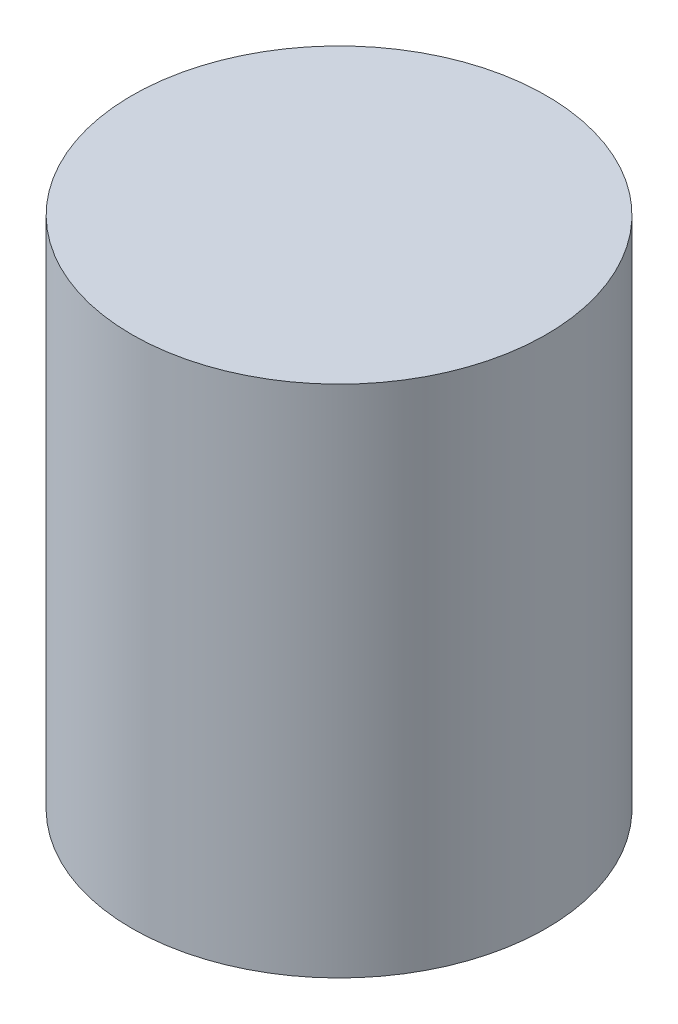
ISO-10303-21;
HEADER;
FILE_DESCRIPTION(('STEP AP214'),'2;1');
FILE_NAME('part.step','',(''),(''),'','','');
FILE_SCHEMA(('AUTOMOTIVE_DESIGN { 1 0 10303 214 1 1 1 1 }'));
ENDSEC;
DATA;
#1=APPLICATION_CONTEXT('core data for automotive mechanical design processes');
#2=APPLICATION_PROTOCOL_DEFINITION('international standard','automotive_design',2000,#1);
#3=PRODUCT_CONTEXT('',#1,'mechanical');
#4=PRODUCT('Part','Part','',(#3));
#5=PRODUCT_RELATED_PRODUCT_CATEGORY('part','',(#4));
#6=PRODUCT_DEFINITION_FORMATION('','',#4);
#7=PRODUCT_DEFINITION_CONTEXT('part definition',#1,'design');
#8=PRODUCT_DEFINITION('design','',#6,#7);
#9=PRODUCT_DEFINITION_SHAPE('','',#8);
#10=(LENGTH_UNIT() NAMED_UNIT(*) SI_UNIT(.MILLI.,.METRE.));
#11=(NAMED_UNIT(*) PLANE_ANGLE_UNIT() SI_UNIT($,.RADIAN.));
#12=(NAMED_UNIT(*) SI_UNIT($,.STERADIAN.) SOLID_ANGLE_UNIT());
#13=UNCERTAINTY_MEASURE_WITH_UNIT(LENGTH_MEASURE(1.E-05),#10,'distance_accuracy_value','');
#14=(GEOMETRIC_REPRESENTATION_CONTEXT(3) GLOBAL_UNCERTAINTY_ASSIGNED_CONTEXT((#13)) GLOBAL_UNIT_ASSIGNED_CONTEXT((#10,
#11,#12)) REPRESENTATION_CONTEXT('',''));
#15=CARTESIAN_POINT('',(0.,0.,0.));
#16=DIRECTION('',(0.,0.,1.));
#17=DIRECTION('',(1.,0.,0.));
#18=AXIS2_PLACEMENT_3D('',#15,#16,#17);
#19=CARTESIAN_POINT('',(0.,72.,0.));
#20=DIRECTION('',(0.,-1.,0.));
#21=DIRECTION('',(0.,0.,-1.));
#22=AXIS2_PLACEMENT_3D('',#19,#20,#21);
#23=CYLINDRICAL_SURFACE('',#22,29.);
#24=CARTESIAN_POINT('',(0.,72.,0.));
#25=DIRECTION('',(0.,1.,0.));
#26=DIRECTION('',(0.,0.,1.));
#27=AXIS2_PLACEMENT_3D('',#24,#25,#26);
#28=CIRCLE('',#27,29.);
#29=CARTESIAN_POINT('',(0.,72.,29.));
#30=VERTEX_POINT('',#29);
#31=EDGE_CURVE('E10',#30,#30,#28,.T.);
#32=ORIENTED_EDGE('',*,*,#31,.F.);
#33=EDGE_LOOP('',(#32));
#34=FACE_BOUND('',#33,.T.);
#35=CARTESIAN_POINT('',(0.,0.,0.));
#36=DIRECTION('',(0.,1.,0.));
#37=DIRECTION('',(0.,0.,1.));
#38=AXIS2_PLACEMENT_3D('',#35,#36,#37);
#39=CIRCLE('',#38,29.);
#40=CARTESIAN_POINT('',(0.,0.,29.));
#41=VERTEX_POINT('',#40);
#42=EDGE_CURVE('E37',#41,#41,#39,.T.);
#43=ORIENTED_EDGE('',*,*,#42,.T.);
#44=EDGE_LOOP('',(#43));
#45=FACE_BOUND('',#44,.T.);
#46=ADVANCED_FACE('F40',(#34,#45),#23,.T.);
#47=CARTESIAN_POINT('',(0.,72.,0.));
#48=DIRECTION('',(0.,1.,0.));
#49=DIRECTION('',(0.,0.,1.));
#50=AXIS2_PLACEMENT_3D('',#47,#48,#49);
#51=PLANE('',#50);
#52=ORIENTED_EDGE('',*,*,#31,.T.);
#53=EDGE_LOOP('',(#52));
#54=FACE_BOUND('',#53,.T.);
#55=ADVANCED_FACE('F55',(#54),#51,.T.);
#56=CARTESIAN_POINT('',(0.,0.,0.));
#57=DIRECTION('',(0.,1.,0.));
#58=DIRECTION('',(0.,0.,1.));
#59=AXIS2_PLACEMENT_3D('',#56,#57,#58);
#60=PLANE('',#59);
#61=ORIENTED_EDGE('',*,*,#42,.F.);
#62=EDGE_LOOP('',(#61));
#63=FACE_BOUND('',#62,.T.);
#64=ADVANCED_FACE('F49',(#63),#60,.F.);
#65=CLOSED_SHELL('',(#46,#55,#64));
#66=MANIFOLD_SOLID_BREP('B2',#65);
#67=ADVANCED_BREP_SHAPE_REPRESENTATION('',(#18,#66),#14);
#68=SHAPE_DEFINITION_REPRESENTATION(#9,#67);
ENDSEC;
END-ISO-10303-21;
